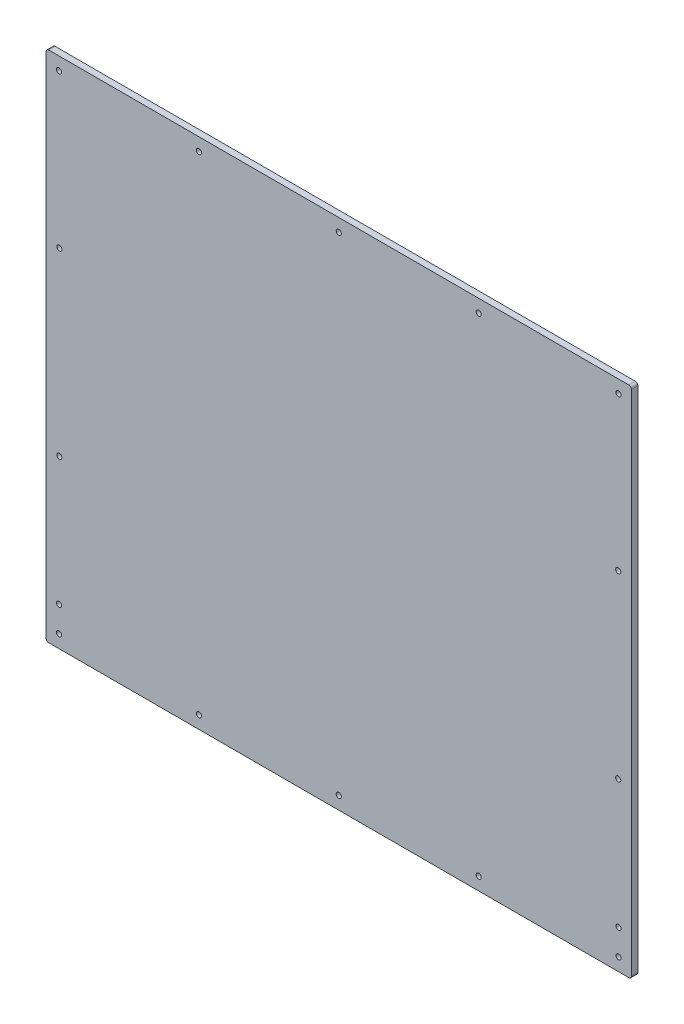
ISO-10303-21;
HEADER;
FILE_DESCRIPTION(('STEP AP214'),'2;1');
FILE_NAME('part.step','',(''),(''),'','','');
FILE_SCHEMA(('AUTOMOTIVE_DESIGN { 1 0 10303 214 1 1 1 1 }'));
ENDSEC;
DATA;
#1=APPLICATION_CONTEXT('core data for automotive mechanical design processes');
#2=APPLICATION_PROTOCOL_DEFINITION('international standard','automotive_design',2000,#1);
#3=PRODUCT_CONTEXT('',#1,'mechanical');
#4=PRODUCT('Part','Part','',(#3));
#5=PRODUCT_RELATED_PRODUCT_CATEGORY('part','',(#4));
#6=PRODUCT_DEFINITION_FORMATION('','',#4);
#7=PRODUCT_DEFINITION_CONTEXT('part definition',#1,'design');
#8=PRODUCT_DEFINITION('design','',#6,#7);
#9=PRODUCT_DEFINITION_SHAPE('','',#8);
#10=(LENGTH_UNIT() NAMED_UNIT(*) SI_UNIT(.MILLI.,.METRE.));
#11=(NAMED_UNIT(*) PLANE_ANGLE_UNIT() SI_UNIT($,.RADIAN.));
#12=(NAMED_UNIT(*) SI_UNIT($,.STERADIAN.) SOLID_ANGLE_UNIT());
#13=UNCERTAINTY_MEASURE_WITH_UNIT(LENGTH_MEASURE(1.E-05),#10,'distance_accuracy_value','');
#14=(GEOMETRIC_REPRESENTATION_CONTEXT(3) GLOBAL_UNCERTAINTY_ASSIGNED_CONTEXT((#13)) GLOBAL_UNIT_ASSIGNED_CONTEXT((#10,
#11,#12)) REPRESENTATION_CONTEXT('',''));
#15=CARTESIAN_POINT('',(0.,0.,0.));
#16=DIRECTION('',(0.,0.,1.));
#17=DIRECTION('',(1.,0.,0.));
#18=AXIS2_PLACEMENT_3D('',#15,#16,#17);
#19=CARTESIAN_POINT('',(-452.,396.,10.));
#20=DIRECTION('',(0.,0.,-1.));
#21=DIRECTION('',(-1.,0.,0.));
#22=AXIS2_PLACEMENT_3D('',#19,#20,#21);
#23=PLANE('',#22);
#24=CARTESIAN_POINT('',(-452.,396.,10.));
#25=DIRECTION('',(0.,0.,1.));
#26=DIRECTION('',(-1.,0.,0.));
#27=AXIS2_PLACEMENT_3D('',#24,#25,#26);
#28=CIRCLE('',#27,4.);
#29=CARTESIAN_POINT('',(-452.,400.,10.));
#30=VERTEX_POINT('',#29);
#31=CARTESIAN_POINT('',(-456.,396.,10.));
#32=VERTEX_POINT('',#31);
#33=EDGE_CURVE('E145',#30,#32,#28,.T.);
#34=ORIENTED_EDGE('',*,*,#33,.T.);
#35=DIRECTION('',(0.,-1.,0.));
#36=VECTOR('',#35,1.);
#37=CARTESIAN_POINT('',(-456.,-396.,10.));
#38=LINE('',#37,#36);
#39=CARTESIAN_POINT('',(-456.,-396.,10.));
#40=VERTEX_POINT('',#39);
#41=EDGE_CURVE('E93',#32,#40,#38,.T.);
#42=ORIENTED_EDGE('',*,*,#41,.T.);
#43=CARTESIAN_POINT('',(-452.,-396.,10.));
#44=DIRECTION('',(0.,0.,1.));
#45=DIRECTION('',(1.,0.,0.));
#46=AXIS2_PLACEMENT_3D('',#43,#44,#45);
#47=CIRCLE('',#46,4.);
#48=CARTESIAN_POINT('',(-452.,-400.,10.));
#49=VERTEX_POINT('',#48);
#50=EDGE_CURVE('E160',#40,#49,#47,.T.);
#51=ORIENTED_EDGE('',*,*,#50,.T.);
#52=DIRECTION('',(1.,0.,0.));
#53=VECTOR('',#52,1.);
#54=CARTESIAN_POINT('',(-452.,-400.,10.));
#55=LINE('',#54,#53);
#56=CARTESIAN_POINT('',(452.,-400.,10.));
#57=VERTEX_POINT('',#56);
#58=EDGE_CURVE('E173',#49,#57,#55,.T.);
#59=ORIENTED_EDGE('',*,*,#58,.T.);
#60=CARTESIAN_POINT('',(452.,-396.,10.));
#61=DIRECTION('',(0.,0.,1.));
#62=DIRECTION('',(1.,0.,0.));
#63=AXIS2_PLACEMENT_3D('',#60,#61,#62);
#64=CIRCLE('',#63,4.);
#65=CARTESIAN_POINT('',(456.,-396.,10.));
#66=VERTEX_POINT('',#65);
#67=EDGE_CURVE('E112',#57,#66,#64,.T.);
#68=ORIENTED_EDGE('',*,*,#67,.T.);
#69=DIRECTION('',(0.,1.,0.));
#70=VECTOR('',#69,1.);
#71=CARTESIAN_POINT('',(456.,-396.,10.));
#72=LINE('',#71,#70);
#73=CARTESIAN_POINT('',(456.,396.,10.));
#74=VERTEX_POINT('',#73);
#75=EDGE_CURVE('E106',#66,#74,#72,.T.);
#76=ORIENTED_EDGE('',*,*,#75,.T.);
#77=CARTESIAN_POINT('',(452.,396.,10.));
#78=DIRECTION('',(0.,0.,1.));
#79=DIRECTION('',(1.,0.,0.));
#80=AXIS2_PLACEMENT_3D('',#77,#78,#79);
#81=CIRCLE('',#80,4.);
#82=CARTESIAN_POINT('',(452.,400.,10.));
#83=VERTEX_POINT('',#82);
#84=EDGE_CURVE('E110',#74,#83,#81,.T.);
#85=ORIENTED_EDGE('',*,*,#84,.T.);
#86=DIRECTION('',(-1.,0.,0.));
#87=VECTOR('',#86,1.);
#88=CARTESIAN_POINT('',(-452.,400.,10.));
#89=LINE('',#88,#87);
#90=EDGE_CURVE('E50',#83,#30,#89,.T.);
#91=ORIENTED_EDGE('',*,*,#90,.T.);
#92=EDGE_LOOP('',(#34,#42,#51,#59,#68,#76,#85,#91));
#93=FACE_BOUND('',#92,.T.);
#94=CARTESIAN_POINT('',(436.,380.,10.));
#95=DIRECTION('',(0.,0.,1.));
#96=DIRECTION('',(1.,0.,0.));
#97=AXIS2_PLACEMENT_3D('',#94,#95,#96);
#98=CIRCLE('',#97,3.99999999999999);
#99=CARTESIAN_POINT('',(440.,380.,10.));
#100=VERTEX_POINT('',#99);
#101=EDGE_CURVE('E134',#100,#100,#98,.T.);
#102=ORIENTED_EDGE('',*,*,#101,.F.);
#103=EDGE_LOOP('',(#102));
#104=FACE_BOUND('',#103,.T.);
#105=CARTESIAN_POINT('',(435.5,141.,10.));
#106=DIRECTION('',(0.,0.,1.));
#107=DIRECTION('',(1.,0.,0.));
#108=AXIS2_PLACEMENT_3D('',#105,#106,#107);
#109=CIRCLE('',#108,3.99999999999999);
#110=CARTESIAN_POINT('',(439.5,141.,10.));
#111=VERTEX_POINT('',#110);
#112=EDGE_CURVE('E182',#111,#111,#109,.T.);
#113=ORIENTED_EDGE('',*,*,#112,.F.);
#114=EDGE_LOOP('',(#113));
#115=FACE_BOUND('',#114,.T.);
#116=CARTESIAN_POINT('',(435.500000000003,-140.,10.));
#117=DIRECTION('',(0.,0.,1.));
#118=DIRECTION('',(1.,0.,0.));
#119=AXIS2_PLACEMENT_3D('',#116,#117,#118);
#120=CIRCLE('',#119,3.99999999999999);
#121=CARTESIAN_POINT('',(439.500000000003,-140.,10.));
#122=VERTEX_POINT('',#121);
#123=EDGE_CURVE('E188',#122,#122,#120,.T.);
#124=ORIENTED_EDGE('',*,*,#123,.F.);
#125=EDGE_LOOP('',(#124));
#126=FACE_BOUND('',#125,.T.);
#127=CARTESIAN_POINT('',(-435.500000000003,-140.,10.));
#128=DIRECTION('',(0.,0.,1.));
#129=DIRECTION('',(-1.,0.,0.));
#130=AXIS2_PLACEMENT_3D('',#127,#128,#129);
#131=CIRCLE('',#130,3.99999999999999);
#132=CARTESIAN_POINT('',(-439.500000000003,-140.,10.));
#133=VERTEX_POINT('',#132);
#134=EDGE_CURVE('E194',#133,#133,#131,.T.);
#135=ORIENTED_EDGE('',*,*,#134,.F.);
#136=EDGE_LOOP('',(#135));
#137=FACE_BOUND('',#136,.T.);
#138=CARTESIAN_POINT('',(-436.,380.,10.));
#139=DIRECTION('',(0.,0.,1.));
#140=DIRECTION('',(-1.,0.,0.));
#141=AXIS2_PLACEMENT_3D('',#138,#139,#140);
#142=CIRCLE('',#141,3.99999999999999);
#143=CARTESIAN_POINT('',(-440.,380.,10.));
#144=VERTEX_POINT('',#143);
#145=EDGE_CURVE('E200',#144,#144,#142,.T.);
#146=ORIENTED_EDGE('',*,*,#145,.F.);
#147=EDGE_LOOP('',(#146));
#148=FACE_BOUND('',#147,.T.);
#149=CARTESIAN_POINT('',(-435.5,141.,10.));
#150=DIRECTION('',(0.,0.,1.));
#151=DIRECTION('',(-1.,0.,0.));
#152=AXIS2_PLACEMENT_3D('',#149,#150,#151);
#153=CIRCLE('',#152,3.99999999999999);
#154=CARTESIAN_POINT('',(-439.5,141.,10.));
#155=VERTEX_POINT('',#154);
#156=EDGE_CURVE('E206',#155,#155,#153,.T.);
#157=ORIENTED_EDGE('',*,*,#156,.F.);
#158=EDGE_LOOP('',(#157));
#159=FACE_BOUND('',#158,.T.);
#160=CARTESIAN_POINT('',(436.,-380.,10.));
#161=DIRECTION('',(0.,0.,1.));
#162=DIRECTION('',(-1.,0.,0.));
#163=AXIS2_PLACEMENT_3D('',#160,#161,#162);
#164=CIRCLE('',#163,3.99999999999999);
#165=CARTESIAN_POINT('',(432.,-380.,10.));
#166=VERTEX_POINT('',#165);
#167=EDGE_CURVE('E212',#166,#166,#164,.T.);
#168=ORIENTED_EDGE('',*,*,#167,.F.);
#169=EDGE_LOOP('',(#168));
#170=FACE_BOUND('',#169,.T.);
#171=CARTESIAN_POINT('',(436.,-340.,10.));
#172=DIRECTION('',(0.,0.,1.));
#173=DIRECTION('',(-1.,0.,0.));
#174=AXIS2_PLACEMENT_3D('',#171,#172,#173);
#175=CIRCLE('',#174,3.99999999999999);
#176=CARTESIAN_POINT('',(432.,-340.,10.));
#177=VERTEX_POINT('',#176);
#178=EDGE_CURVE('E218',#177,#177,#175,.T.);
#179=ORIENTED_EDGE('',*,*,#178,.F.);
#180=EDGE_LOOP('',(#179));
#181=FACE_BOUND('',#180,.T.);
#182=CARTESIAN_POINT('',(-435.999999999999,-340.,10.));
#183=DIRECTION('',(0.,0.,1.));
#184=DIRECTION('',(1.,0.,0.));
#185=AXIS2_PLACEMENT_3D('',#182,#183,#184);
#186=CIRCLE('',#185,3.99999999999999);
#187=CARTESIAN_POINT('',(-431.999999999999,-340.,10.));
#188=VERTEX_POINT('',#187);
#189=EDGE_CURVE('E224',#188,#188,#186,.T.);
#190=ORIENTED_EDGE('',*,*,#189,.F.);
#191=EDGE_LOOP('',(#190));
#192=FACE_BOUND('',#191,.T.);
#193=CARTESIAN_POINT('',(-435.999999999999,-380.,10.));
#194=DIRECTION('',(0.,0.,1.));
#195=DIRECTION('',(1.,0.,0.));
#196=AXIS2_PLACEMENT_3D('',#193,#194,#195);
#197=CIRCLE('',#196,3.99999999999999);
#198=CARTESIAN_POINT('',(-431.999999999999,-380.,10.));
#199=VERTEX_POINT('',#198);
#200=EDGE_CURVE('E230',#199,#199,#197,.T.);
#201=ORIENTED_EDGE('',*,*,#200,.F.);
#202=EDGE_LOOP('',(#201));
#203=FACE_BOUND('',#202,.T.);
#204=CARTESIAN_POINT('',(-218.,380.000000000005,10.));
#205=DIRECTION('',(0.,0.,1.));
#206=DIRECTION('',(1.,0.,0.));
#207=AXIS2_PLACEMENT_3D('',#204,#205,#206);
#208=CIRCLE('',#207,3.99999999999999);
#209=CARTESIAN_POINT('',(-214.,380.000000000005,10.));
#210=VERTEX_POINT('',#209);
#211=EDGE_CURVE('E236',#210,#210,#208,.T.);
#212=ORIENTED_EDGE('',*,*,#211,.F.);
#213=EDGE_LOOP('',(#212));
#214=FACE_BOUND('',#213,.T.);
#215=CARTESIAN_POINT('',(218.,-380.000000000002,10.));
#216=DIRECTION('',(0.,0.,1.));
#217=DIRECTION('',(-1.,0.,0.));
#218=AXIS2_PLACEMENT_3D('',#215,#216,#217);
#219=CIRCLE('',#218,3.99999999999999);
#220=CARTESIAN_POINT('',(214.,-380.000000000002,10.));
#221=VERTEX_POINT('',#220);
#222=EDGE_CURVE('E242',#221,#221,#219,.T.);
#223=ORIENTED_EDGE('',*,*,#222,.F.);
#224=EDGE_LOOP('',(#223));
#225=FACE_BOUND('',#224,.T.);
#226=CARTESIAN_POINT('',(-2.22044604925031E-13,-380.000000000003,10.));
#227=DIRECTION('',(0.,0.,1.));
#228=DIRECTION('',(-1.,0.,0.));
#229=AXIS2_PLACEMENT_3D('',#226,#227,#228);
#230=CIRCLE('',#229,3.99999999999999);
#231=CARTESIAN_POINT('',(-4.00000000000021,-380.000000000003,10.));
#232=VERTEX_POINT('',#231);
#233=EDGE_CURVE('E248',#232,#232,#230,.T.);
#234=ORIENTED_EDGE('',*,*,#233,.F.);
#235=EDGE_LOOP('',(#234));
#236=FACE_BOUND('',#235,.T.);
#237=CARTESIAN_POINT('',(-218.,-380.000000000005,10.));
#238=DIRECTION('',(0.,0.,1.));
#239=DIRECTION('',(-1.,0.,0.));
#240=AXIS2_PLACEMENT_3D('',#237,#238,#239);
#241=CIRCLE('',#240,3.99999999999999);
#242=CARTESIAN_POINT('',(-222.,-380.000000000005,10.));
#243=VERTEX_POINT('',#242);
#244=EDGE_CURVE('E254',#243,#243,#241,.T.);
#245=ORIENTED_EDGE('',*,*,#244,.F.);
#246=EDGE_LOOP('',(#245));
#247=FACE_BOUND('',#246,.T.);
#248=CARTESIAN_POINT('',(-4.44089209850063E-13,380.000000000003,10.));
#249=DIRECTION('',(0.,0.,1.));
#250=DIRECTION('',(1.,0.,0.));
#251=AXIS2_PLACEMENT_3D('',#248,#249,#250);
#252=CIRCLE('',#251,3.99999999999999);
#253=CARTESIAN_POINT('',(3.99999999999955,380.000000000003,10.));
#254=VERTEX_POINT('',#253);
#255=EDGE_CURVE('E260',#254,#254,#252,.T.);
#256=ORIENTED_EDGE('',*,*,#255,.F.);
#257=EDGE_LOOP('',(#256));
#258=FACE_BOUND('',#257,.T.);
#259=CARTESIAN_POINT('',(217.999999999999,380.000000000002,10.));
#260=DIRECTION('',(0.,0.,1.));
#261=DIRECTION('',(1.,0.,0.));
#262=AXIS2_PLACEMENT_3D('',#259,#260,#261);
#263=CIRCLE('',#262,3.99999999999999);
#264=CARTESIAN_POINT('',(221.999999999999,380.000000000002,10.));
#265=VERTEX_POINT('',#264);
#266=EDGE_CURVE('E266',#265,#265,#263,.T.);
#267=ORIENTED_EDGE('',*,*,#266,.F.);
#268=EDGE_LOOP('',(#267));
#269=FACE_BOUND('',#268,.T.);
#270=ADVANCED_FACE('F33',(#93,#104,#115,#126,#137,#148,#159,#170,#181,#192,#203,#214,#225,#236,
#247,#258,#269),#23,.F.);
#271=CARTESIAN_POINT('',(-452.,396.,0.));
#272=DIRECTION('',(0.,0.,-1.));
#273=DIRECTION('',(-1.,0.,0.));
#274=AXIS2_PLACEMENT_3D('',#271,#272,#273);
#275=PLANE('',#274);
#276=CARTESIAN_POINT('',(-4.44089209850063E-13,380.000000000003,0.));
#277=DIRECTION('',(0.,0.,1.));
#278=DIRECTION('',(1.,0.,0.));
#279=AXIS2_PLACEMENT_3D('',#276,#277,#278);
#280=CIRCLE('',#279,3.99999999999999);
#281=CARTESIAN_POINT('',(3.99999999999955,380.000000000003,0.));
#282=VERTEX_POINT('',#281);
#283=EDGE_CURVE('E263',#282,#282,#280,.T.);
#284=ORIENTED_EDGE('',*,*,#283,.T.);
#285=EDGE_LOOP('',(#284));
#286=FACE_BOUND('',#285,.T.);
#287=CARTESIAN_POINT('',(-2.22044604925031E-13,-380.000000000003,0.));
#288=DIRECTION('',(0.,0.,1.));
#289=DIRECTION('',(-1.,0.,0.));
#290=AXIS2_PLACEMENT_3D('',#287,#288,#289);
#291=CIRCLE('',#290,3.99999999999999);
#292=CARTESIAN_POINT('',(-4.00000000000021,-380.000000000003,0.));
#293=VERTEX_POINT('',#292);
#294=EDGE_CURVE('E251',#293,#293,#291,.T.);
#295=ORIENTED_EDGE('',*,*,#294,.T.);
#296=EDGE_LOOP('',(#295));
#297=FACE_BOUND('',#296,.T.);
#298=CARTESIAN_POINT('',(-218.,380.000000000005,0.));
#299=DIRECTION('',(0.,0.,1.));
#300=DIRECTION('',(1.,0.,0.));
#301=AXIS2_PLACEMENT_3D('',#298,#299,#300);
#302=CIRCLE('',#301,3.99999999999999);
#303=CARTESIAN_POINT('',(-214.,380.000000000005,0.));
#304=VERTEX_POINT('',#303);
#305=EDGE_CURVE('E239',#304,#304,#302,.T.);
#306=ORIENTED_EDGE('',*,*,#305,.T.);
#307=EDGE_LOOP('',(#306));
#308=FACE_BOUND('',#307,.T.);
#309=CARTESIAN_POINT('',(-435.999999999999,-340.,0.));
#310=DIRECTION('',(0.,0.,1.));
#311=DIRECTION('',(1.,0.,0.));
#312=AXIS2_PLACEMENT_3D('',#309,#310,#311);
#313=CIRCLE('',#312,3.99999999999999);
#314=CARTESIAN_POINT('',(-431.999999999999,-340.,0.));
#315=VERTEX_POINT('',#314);
#316=EDGE_CURVE('E227',#315,#315,#313,.T.);
#317=ORIENTED_EDGE('',*,*,#316,.T.);
#318=EDGE_LOOP('',(#317));
#319=FACE_BOUND('',#318,.T.);
#320=CARTESIAN_POINT('',(436.,-380.,0.));
#321=DIRECTION('',(0.,0.,1.));
#322=DIRECTION('',(-1.,0.,0.));
#323=AXIS2_PLACEMENT_3D('',#320,#321,#322);
#324=CIRCLE('',#323,3.99999999999999);
#325=CARTESIAN_POINT('',(432.,-380.,0.));
#326=VERTEX_POINT('',#325);
#327=EDGE_CURVE('E215',#326,#326,#324,.T.);
#328=ORIENTED_EDGE('',*,*,#327,.T.);
#329=EDGE_LOOP('',(#328));
#330=FACE_BOUND('',#329,.T.);
#331=CARTESIAN_POINT('',(-436.,380.,0.));
#332=DIRECTION('',(0.,0.,1.));
#333=DIRECTION('',(-1.,0.,0.));
#334=AXIS2_PLACEMENT_3D('',#331,#332,#333);
#335=CIRCLE('',#334,3.99999999999999);
#336=CARTESIAN_POINT('',(-440.,380.,0.));
#337=VERTEX_POINT('',#336);
#338=EDGE_CURVE('E203',#337,#337,#335,.T.);
#339=ORIENTED_EDGE('',*,*,#338,.T.);
#340=EDGE_LOOP('',(#339));
#341=FACE_BOUND('',#340,.T.);
#342=CARTESIAN_POINT('',(435.500000000003,-140.,0.));
#343=DIRECTION('',(0.,0.,1.));
#344=DIRECTION('',(1.,0.,0.));
#345=AXIS2_PLACEMENT_3D('',#342,#343,#344);
#346=CIRCLE('',#345,3.99999999999999);
#347=CARTESIAN_POINT('',(439.500000000003,-140.,0.));
#348=VERTEX_POINT('',#347);
#349=EDGE_CURVE('E191',#348,#348,#346,.T.);
#350=ORIENTED_EDGE('',*,*,#349,.T.);
#351=EDGE_LOOP('',(#350));
#352=FACE_BOUND('',#351,.T.);
#353=CARTESIAN_POINT('',(436.,380.,0.));
#354=DIRECTION('',(0.,0.,1.));
#355=DIRECTION('',(1.,0.,0.));
#356=AXIS2_PLACEMENT_3D('',#353,#354,#355);
#357=CIRCLE('',#356,3.99999999999999);
#358=CARTESIAN_POINT('',(440.,380.,0.));
#359=VERTEX_POINT('',#358);
#360=EDGE_CURVE('E179',#359,#359,#357,.T.);
#361=ORIENTED_EDGE('',*,*,#360,.T.);
#362=EDGE_LOOP('',(#361));
#363=FACE_BOUND('',#362,.T.);
#364=CARTESIAN_POINT('',(-452.,396.,0.));
#365=DIRECTION('',(0.,0.,1.));
#366=DIRECTION('',(-1.,0.,0.));
#367=AXIS2_PLACEMENT_3D('',#364,#365,#366);
#368=CIRCLE('',#367,4.);
#369=CARTESIAN_POINT('',(-452.,400.,0.));
#370=VERTEX_POINT('',#369);
#371=CARTESIAN_POINT('',(-456.,396.,0.));
#372=VERTEX_POINT('',#371);
#373=EDGE_CURVE('E130',#370,#372,#368,.T.);
#374=ORIENTED_EDGE('',*,*,#373,.F.);
#375=DIRECTION('',(-1.,0.,0.));
#376=VECTOR('',#375,1.);
#377=CARTESIAN_POINT('',(-452.,400.,0.));
#378=LINE('',#377,#376);
#379=CARTESIAN_POINT('',(452.,400.,0.));
#380=VERTEX_POINT('',#379);
#381=EDGE_CURVE('E85',#380,#370,#378,.T.);
#382=ORIENTED_EDGE('',*,*,#381,.F.);
#383=CARTESIAN_POINT('',(452.,396.,0.));
#384=DIRECTION('',(0.,0.,1.));
#385=DIRECTION('',(1.,0.,0.));
#386=AXIS2_PLACEMENT_3D('',#383,#384,#385);
#387=CIRCLE('',#386,4.);
#388=CARTESIAN_POINT('',(456.,396.,0.));
#389=VERTEX_POINT('',#388);
#390=EDGE_CURVE('E79',#389,#380,#387,.T.);
#391=ORIENTED_EDGE('',*,*,#390,.F.);
#392=DIRECTION('',(0.,1.,0.));
#393=VECTOR('',#392,1.);
#394=CARTESIAN_POINT('',(456.,-396.,0.));
#395=LINE('',#394,#393);
#396=CARTESIAN_POINT('',(456.,-396.,0.));
#397=VERTEX_POINT('',#396);
#398=EDGE_CURVE('E120',#397,#389,#395,.T.);
#399=ORIENTED_EDGE('',*,*,#398,.F.);
#400=CARTESIAN_POINT('',(452.,-396.,0.));
#401=DIRECTION('',(0.,0.,1.));
#402=DIRECTION('',(1.,0.,0.));
#403=AXIS2_PLACEMENT_3D('',#400,#401,#402);
#404=CIRCLE('',#403,4.);
#405=CARTESIAN_POINT('',(452.,-400.,0.));
#406=VERTEX_POINT('',#405);
#407=EDGE_CURVE('E140',#406,#397,#404,.T.);
#408=ORIENTED_EDGE('',*,*,#407,.F.);
#409=DIRECTION('',(1.,0.,0.));
#410=VECTOR('',#409,1.);
#411=CARTESIAN_POINT('',(-452.,-400.,0.));
#412=LINE('',#411,#410);
#413=CARTESIAN_POINT('',(-452.,-400.,0.));
#414=VERTEX_POINT('',#413);
#415=EDGE_CURVE('E138',#414,#406,#412,.T.);
#416=ORIENTED_EDGE('',*,*,#415,.F.);
#417=CARTESIAN_POINT('',(-452.,-396.,0.));
#418=DIRECTION('',(0.,0.,1.));
#419=DIRECTION('',(1.,0.,0.));
#420=AXIS2_PLACEMENT_3D('',#417,#418,#419);
#421=CIRCLE('',#420,4.);
#422=CARTESIAN_POINT('',(-456.,-396.,0.));
#423=VERTEX_POINT('',#422);
#424=EDGE_CURVE('E136',#423,#414,#421,.T.);
#425=ORIENTED_EDGE('',*,*,#424,.F.);
#426=DIRECTION('',(0.,-1.,0.));
#427=VECTOR('',#426,1.);
#428=CARTESIAN_POINT('',(-456.,-396.,0.));
#429=LINE('',#428,#427);
#430=EDGE_CURVE('E133',#372,#423,#429,.T.);
#431=ORIENTED_EDGE('',*,*,#430,.F.);
#432=EDGE_LOOP('',(#374,#382,#391,#399,#408,#416,#425,#431));
#433=FACE_BOUND('',#432,.T.);
#434=CARTESIAN_POINT('',(435.5,141.,0.));
#435=DIRECTION('',(0.,0.,1.));
#436=DIRECTION('',(1.,0.,0.));
#437=AXIS2_PLACEMENT_3D('',#434,#435,#436);
#438=CIRCLE('',#437,3.99999999999999);
#439=CARTESIAN_POINT('',(439.5,141.,0.));
#440=VERTEX_POINT('',#439);
#441=EDGE_CURVE('E185',#440,#440,#438,.T.);
#442=ORIENTED_EDGE('',*,*,#441,.T.);
#443=EDGE_LOOP('',(#442));
#444=FACE_BOUND('',#443,.T.);
#445=CARTESIAN_POINT('',(-435.500000000003,-140.,0.));
#446=DIRECTION('',(0.,0.,1.));
#447=DIRECTION('',(-1.,0.,0.));
#448=AXIS2_PLACEMENT_3D('',#445,#446,#447);
#449=CIRCLE('',#448,3.99999999999999);
#450=CARTESIAN_POINT('',(-439.500000000003,-140.,0.));
#451=VERTEX_POINT('',#450);
#452=EDGE_CURVE('E197',#451,#451,#449,.T.);
#453=ORIENTED_EDGE('',*,*,#452,.T.);
#454=EDGE_LOOP('',(#453));
#455=FACE_BOUND('',#454,.T.);
#456=CARTESIAN_POINT('',(-435.5,141.,0.));
#457=DIRECTION('',(0.,0.,1.));
#458=DIRECTION('',(-1.,0.,0.));
#459=AXIS2_PLACEMENT_3D('',#456,#457,#458);
#460=CIRCLE('',#459,3.99999999999999);
#461=CARTESIAN_POINT('',(-439.5,141.,0.));
#462=VERTEX_POINT('',#461);
#463=EDGE_CURVE('E209',#462,#462,#460,.T.);
#464=ORIENTED_EDGE('',*,*,#463,.T.);
#465=EDGE_LOOP('',(#464));
#466=FACE_BOUND('',#465,.T.);
#467=CARTESIAN_POINT('',(436.,-340.,0.));
#468=DIRECTION('',(0.,0.,1.));
#469=DIRECTION('',(-1.,0.,0.));
#470=AXIS2_PLACEMENT_3D('',#467,#468,#469);
#471=CIRCLE('',#470,3.99999999999999);
#472=CARTESIAN_POINT('',(432.,-340.,0.));
#473=VERTEX_POINT('',#472);
#474=EDGE_CURVE('E221',#473,#473,#471,.T.);
#475=ORIENTED_EDGE('',*,*,#474,.T.);
#476=EDGE_LOOP('',(#475));
#477=FACE_BOUND('',#476,.T.);
#478=CARTESIAN_POINT('',(-435.999999999999,-380.,0.));
#479=DIRECTION('',(0.,0.,1.));
#480=DIRECTION('',(1.,0.,0.));
#481=AXIS2_PLACEMENT_3D('',#478,#479,#480);
#482=CIRCLE('',#481,3.99999999999999);
#483=CARTESIAN_POINT('',(-431.999999999999,-380.,0.));
#484=VERTEX_POINT('',#483);
#485=EDGE_CURVE('E233',#484,#484,#482,.T.);
#486=ORIENTED_EDGE('',*,*,#485,.T.);
#487=EDGE_LOOP('',(#486));
#488=FACE_BOUND('',#487,.T.);
#489=CARTESIAN_POINT('',(218.,-380.000000000002,0.));
#490=DIRECTION('',(0.,0.,1.));
#491=DIRECTION('',(-1.,0.,0.));
#492=AXIS2_PLACEMENT_3D('',#489,#490,#491);
#493=CIRCLE('',#492,3.99999999999999);
#494=CARTESIAN_POINT('',(214.,-380.000000000002,0.));
#495=VERTEX_POINT('',#494);
#496=EDGE_CURVE('E245',#495,#495,#493,.T.);
#497=ORIENTED_EDGE('',*,*,#496,.T.);
#498=EDGE_LOOP('',(#497));
#499=FACE_BOUND('',#498,.T.);
#500=CARTESIAN_POINT('',(-218.,-380.000000000005,0.));
#501=DIRECTION('',(0.,0.,1.));
#502=DIRECTION('',(-1.,0.,0.));
#503=AXIS2_PLACEMENT_3D('',#500,#501,#502);
#504=CIRCLE('',#503,3.99999999999999);
#505=CARTESIAN_POINT('',(-222.,-380.000000000005,0.));
#506=VERTEX_POINT('',#505);
#507=EDGE_CURVE('E257',#506,#506,#504,.T.);
#508=ORIENTED_EDGE('',*,*,#507,.T.);
#509=EDGE_LOOP('',(#508));
#510=FACE_BOUND('',#509,.T.);
#511=CARTESIAN_POINT('',(217.999999999999,380.000000000002,0.));
#512=DIRECTION('',(0.,0.,1.));
#513=DIRECTION('',(1.,0.,0.));
#514=AXIS2_PLACEMENT_3D('',#511,#512,#513);
#515=CIRCLE('',#514,3.99999999999999);
#516=CARTESIAN_POINT('',(221.999999999999,380.000000000002,0.));
#517=VERTEX_POINT('',#516);
#518=EDGE_CURVE('E269',#517,#517,#515,.T.);
#519=ORIENTED_EDGE('',*,*,#518,.T.);
#520=EDGE_LOOP('',(#519));
#521=FACE_BOUND('',#520,.T.);
#522=ADVANCED_FACE('F164',(#286,#297,#308,#319,#330,#341,#352,#363,#433,#444,#455,#466,#477,
#488,#499,#510,#521),#275,.T.);
#523=CARTESIAN_POINT('',(-452.,396.,10.));
#524=DIRECTION('',(0.,0.,-1.));
#525=DIRECTION('',(-1.,0.,0.));
#526=AXIS2_PLACEMENT_3D('',#523,#524,#525);
#527=CYLINDRICAL_SURFACE('',#526,4.);
#528=ORIENTED_EDGE('',*,*,#373,.T.);
#529=DIRECTION('',(0.,0.,-1.));
#530=VECTOR('',#529,1.);
#531=CARTESIAN_POINT('',(-456.,396.,10.));
#532=LINE('',#531,#530);
#533=EDGE_CURVE('E11',#32,#372,#532,.T.);
#534=ORIENTED_EDGE('',*,*,#533,.F.);
#535=ORIENTED_EDGE('',*,*,#33,.F.);
#536=DIRECTION('',(0.,0.,-1.));
#537=VECTOR('',#536,1.);
#538=CARTESIAN_POINT('',(-452.,400.,10.));
#539=LINE('',#538,#537);
#540=EDGE_CURVE('E126',#30,#370,#539,.T.);
#541=ORIENTED_EDGE('',*,*,#540,.T.);
#542=EDGE_LOOP('',(#528,#534,#535,#541));
#543=FACE_BOUND('',#542,.T.);
#544=ADVANCED_FACE('F35',(#543),#527,.T.);
#545=CARTESIAN_POINT('',(-456.,-396.,10.));
#546=DIRECTION('',(1.,0.,0.));
#547=DIRECTION('',(0.,0.,-1.));
#548=AXIS2_PLACEMENT_3D('',#545,#546,#547);
#549=PLANE('',#548);
#550=ORIENTED_EDGE('',*,*,#430,.T.);
#551=DIRECTION('',(0.,0.,-1.));
#552=VECTOR('',#551,1.);
#553=CARTESIAN_POINT('',(-456.,-396.,10.));
#554=LINE('',#553,#552);
#555=EDGE_CURVE('E42',#40,#423,#554,.T.);
#556=ORIENTED_EDGE('',*,*,#555,.F.);
#557=ORIENTED_EDGE('',*,*,#41,.F.);
#558=ORIENTED_EDGE('',*,*,#533,.T.);
#559=EDGE_LOOP('',(#550,#556,#557,#558));
#560=FACE_BOUND('',#559,.T.);
#561=ADVANCED_FACE('F301',(#560),#549,.F.);
#562=CARTESIAN_POINT('',(-452.,-396.,10.));
#563=DIRECTION('',(0.,0.,-1.));
#564=DIRECTION('',(-1.,0.,0.));
#565=AXIS2_PLACEMENT_3D('',#562,#563,#564);
#566=CYLINDRICAL_SURFACE('',#565,4.);
#567=ORIENTED_EDGE('',*,*,#424,.T.);
#568=DIRECTION('',(0.,0.,-1.));
#569=VECTOR('',#568,1.);
#570=CARTESIAN_POINT('',(-452.,-400.,10.));
#571=LINE('',#570,#569);
#572=EDGE_CURVE('E152',#49,#414,#571,.T.);
#573=ORIENTED_EDGE('',*,*,#572,.F.);
#574=ORIENTED_EDGE('',*,*,#50,.F.);
#575=ORIENTED_EDGE('',*,*,#555,.T.);
#576=EDGE_LOOP('',(#567,#573,#574,#575));
#577=FACE_BOUND('',#576,.T.);
#578=ADVANCED_FACE('F158',(#577),#566,.T.);
#579=CARTESIAN_POINT('',(-452.,-400.,10.));
#580=DIRECTION('',(0.,1.,0.));
#581=DIRECTION('',(0.,0.,1.));
#582=AXIS2_PLACEMENT_3D('',#579,#580,#581);
#583=PLANE('',#582);
#584=ORIENTED_EDGE('',*,*,#415,.T.);
#585=DIRECTION('',(0.,0.,-1.));
#586=VECTOR('',#585,1.);
#587=CARTESIAN_POINT('',(452.,-400.,10.));
#588=LINE('',#587,#586);
#589=EDGE_CURVE('E149',#57,#406,#588,.T.);
#590=ORIENTED_EDGE('',*,*,#589,.F.);
#591=ORIENTED_EDGE('',*,*,#58,.F.);
#592=ORIENTED_EDGE('',*,*,#572,.T.);
#593=EDGE_LOOP('',(#584,#590,#591,#592));
#594=FACE_BOUND('',#593,.T.);
#595=ADVANCED_FACE('F169',(#594),#583,.F.);
#596=CARTESIAN_POINT('',(452.,-396.,10.));
#597=DIRECTION('',(0.,0.,-1.));
#598=DIRECTION('',(-1.,0.,0.));
#599=AXIS2_PLACEMENT_3D('',#596,#597,#598);
#600=CYLINDRICAL_SURFACE('',#599,4.);
#601=ORIENTED_EDGE('',*,*,#407,.T.);
#602=DIRECTION('',(0.,0.,-1.));
#603=VECTOR('',#602,1.);
#604=CARTESIAN_POINT('',(456.,-396.,10.));
#605=LINE('',#604,#603);
#606=EDGE_CURVE('E121',#66,#397,#605,.T.);
#607=ORIENTED_EDGE('',*,*,#606,.F.);
#608=ORIENTED_EDGE('',*,*,#67,.F.);
#609=ORIENTED_EDGE('',*,*,#589,.T.);
#610=EDGE_LOOP('',(#601,#607,#608,#609));
#611=FACE_BOUND('',#610,.T.);
#612=ADVANCED_FACE('F172',(#611),#600,.T.);
#613=CARTESIAN_POINT('',(456.,-396.,10.));
#614=DIRECTION('',(-1.,0.,0.));
#615=DIRECTION('',(0.,0.,1.));
#616=AXIS2_PLACEMENT_3D('',#613,#614,#615);
#617=PLANE('',#616);
#618=ORIENTED_EDGE('',*,*,#398,.T.);
#619=DIRECTION('',(0.,0.,-1.));
#620=VECTOR('',#619,1.);
#621=CARTESIAN_POINT('',(456.,396.,10.));
#622=LINE('',#621,#620);
#623=EDGE_CURVE('E117',#74,#389,#622,.T.);
#624=ORIENTED_EDGE('',*,*,#623,.F.);
#625=ORIENTED_EDGE('',*,*,#75,.F.);
#626=ORIENTED_EDGE('',*,*,#606,.T.);
#627=EDGE_LOOP('',(#618,#624,#625,#626));
#628=FACE_BOUND('',#627,.T.);
#629=ADVANCED_FACE('F118',(#628),#617,.F.);
#630=CARTESIAN_POINT('',(452.,396.,10.));
#631=DIRECTION('',(0.,0.,-1.));
#632=DIRECTION('',(-1.,0.,0.));
#633=AXIS2_PLACEMENT_3D('',#630,#631,#632);
#634=CYLINDRICAL_SURFACE('',#633,4.);
#635=ORIENTED_EDGE('',*,*,#390,.T.);
#636=DIRECTION('',(0.,0.,-1.));
#637=VECTOR('',#636,1.);
#638=CARTESIAN_POINT('',(452.,400.,10.));
#639=LINE('',#638,#637);
#640=EDGE_CURVE('E122',#83,#380,#639,.T.);
#641=ORIENTED_EDGE('',*,*,#640,.F.);
#642=ORIENTED_EDGE('',*,*,#84,.F.);
#643=ORIENTED_EDGE('',*,*,#623,.T.);
#644=EDGE_LOOP('',(#635,#641,#642,#643));
#645=FACE_BOUND('',#644,.T.);
#646=ADVANCED_FACE('F124',(#645),#634,.T.);
#647=CARTESIAN_POINT('',(-452.,400.,10.));
#648=DIRECTION('',(0.,-1.,0.));
#649=DIRECTION('',(0.,0.,-1.));
#650=AXIS2_PLACEMENT_3D('',#647,#648,#649);
#651=PLANE('',#650);
#652=ORIENTED_EDGE('',*,*,#381,.T.);
#653=ORIENTED_EDGE('',*,*,#540,.F.);
#654=ORIENTED_EDGE('',*,*,#90,.F.);
#655=ORIENTED_EDGE('',*,*,#640,.T.);
#656=EDGE_LOOP('',(#652,#653,#654,#655));
#657=FACE_BOUND('',#656,.T.);
#658=ADVANCED_FACE('F289',(#657),#651,.F.);
#659=CARTESIAN_POINT('',(436.,380.,10.));
#660=DIRECTION('',(0.,0.,-1.));
#661=DIRECTION('',(-1.,0.,0.));
#662=AXIS2_PLACEMENT_3D('',#659,#660,#661);
#663=CYLINDRICAL_SURFACE('',#662,3.99999999999999);
#664=ORIENTED_EDGE('',*,*,#101,.T.);
#665=EDGE_LOOP('',(#664));
#666=FACE_BOUND('',#665,.T.);
#667=ORIENTED_EDGE('',*,*,#360,.F.);
#668=EDGE_LOOP('',(#667));
#669=FACE_BOUND('',#668,.T.);
#670=ADVANCED_FACE('F286',(#666,#669),#663,.F.);
#671=CARTESIAN_POINT('',(435.5,141.,10.));
#672=DIRECTION('',(0.,0.,-1.));
#673=DIRECTION('',(-1.,0.,0.));
#674=AXIS2_PLACEMENT_3D('',#671,#672,#673);
#675=CYLINDRICAL_SURFACE('',#674,3.99999999999999);
#676=ORIENTED_EDGE('',*,*,#112,.T.);
#677=EDGE_LOOP('',(#676));
#678=FACE_BOUND('',#677,.T.);
#679=ORIENTED_EDGE('',*,*,#441,.F.);
#680=EDGE_LOOP('',(#679));
#681=FACE_BOUND('',#680,.T.);
#682=ADVANCED_FACE('F365',(#678,#681),#675,.F.);
#683=CARTESIAN_POINT('',(435.500000000003,-140.,10.));
#684=DIRECTION('',(0.,0.,-1.));
#685=DIRECTION('',(-1.,0.,0.));
#686=AXIS2_PLACEMENT_3D('',#683,#684,#685);
#687=CYLINDRICAL_SURFACE('',#686,3.99999999999999);
#688=ORIENTED_EDGE('',*,*,#123,.T.);
#689=EDGE_LOOP('',(#688));
#690=FACE_BOUND('',#689,.T.);
#691=ORIENTED_EDGE('',*,*,#349,.F.);
#692=EDGE_LOOP('',(#691));
#693=FACE_BOUND('',#692,.T.);
#694=ADVANCED_FACE('F373',(#690,#693),#687,.F.);
#695=CARTESIAN_POINT('',(-435.500000000003,-140.,10.));
#696=DIRECTION('',(0.,0.,-1.));
#697=DIRECTION('',(-1.,0.,0.));
#698=AXIS2_PLACEMENT_3D('',#695,#696,#697);
#699=CYLINDRICAL_SURFACE('',#698,3.99999999999999);
#700=ORIENTED_EDGE('',*,*,#134,.T.);
#701=EDGE_LOOP('',(#700));
#702=FACE_BOUND('',#701,.T.);
#703=ORIENTED_EDGE('',*,*,#452,.F.);
#704=EDGE_LOOP('',(#703));
#705=FACE_BOUND('',#704,.T.);
#706=ADVANCED_FACE('F381',(#702,#705),#699,.F.);
#707=CARTESIAN_POINT('',(-436.,380.,10.));
#708=DIRECTION('',(0.,0.,-1.));
#709=DIRECTION('',(-1.,0.,0.));
#710=AXIS2_PLACEMENT_3D('',#707,#708,#709);
#711=CYLINDRICAL_SURFACE('',#710,3.99999999999999);
#712=ORIENTED_EDGE('',*,*,#145,.T.);
#713=EDGE_LOOP('',(#712));
#714=FACE_BOUND('',#713,.T.);
#715=ORIENTED_EDGE('',*,*,#338,.F.);
#716=EDGE_LOOP('',(#715));
#717=FACE_BOUND('',#716,.T.);
#718=ADVANCED_FACE('F390',(#714,#717),#711,.F.);
#719=CARTESIAN_POINT('',(-435.5,141.,10.));
#720=DIRECTION('',(0.,0.,-1.));
#721=DIRECTION('',(-1.,0.,0.));
#722=AXIS2_PLACEMENT_3D('',#719,#720,#721);
#723=CYLINDRICAL_SURFACE('',#722,3.99999999999999);
#724=ORIENTED_EDGE('',*,*,#156,.T.);
#725=EDGE_LOOP('',(#724));
#726=FACE_BOUND('',#725,.T.);
#727=ORIENTED_EDGE('',*,*,#463,.F.);
#728=EDGE_LOOP('',(#727));
#729=FACE_BOUND('',#728,.T.);
#730=ADVANCED_FACE('F399',(#726,#729),#723,.F.);
#731=CARTESIAN_POINT('',(436.,-380.,10.));
#732=DIRECTION('',(0.,0.,-1.));
#733=DIRECTION('',(-1.,0.,0.));
#734=AXIS2_PLACEMENT_3D('',#731,#732,#733);
#735=CYLINDRICAL_SURFACE('',#734,3.99999999999999);
#736=ORIENTED_EDGE('',*,*,#167,.T.);
#737=EDGE_LOOP('',(#736));
#738=FACE_BOUND('',#737,.T.);
#739=ORIENTED_EDGE('',*,*,#327,.F.);
#740=EDGE_LOOP('',(#739));
#741=FACE_BOUND('',#740,.T.);
#742=ADVANCED_FACE('F408',(#738,#741),#735,.F.);
#743=CARTESIAN_POINT('',(436.,-340.,10.));
#744=DIRECTION('',(0.,0.,-1.));
#745=DIRECTION('',(-1.,0.,0.));
#746=AXIS2_PLACEMENT_3D('',#743,#744,#745);
#747=CYLINDRICAL_SURFACE('',#746,3.99999999999999);
#748=ORIENTED_EDGE('',*,*,#178,.T.);
#749=EDGE_LOOP('',(#748));
#750=FACE_BOUND('',#749,.T.);
#751=ORIENTED_EDGE('',*,*,#474,.F.);
#752=EDGE_LOOP('',(#751));
#753=FACE_BOUND('',#752,.T.);
#754=ADVANCED_FACE('F417',(#750,#753),#747,.F.);
#755=CARTESIAN_POINT('',(-435.999999999999,-340.,10.));
#756=DIRECTION('',(0.,0.,-1.));
#757=DIRECTION('',(-1.,0.,0.));
#758=AXIS2_PLACEMENT_3D('',#755,#756,#757);
#759=CYLINDRICAL_SURFACE('',#758,3.99999999999999);
#760=ORIENTED_EDGE('',*,*,#189,.T.);
#761=EDGE_LOOP('',(#760));
#762=FACE_BOUND('',#761,.T.);
#763=ORIENTED_EDGE('',*,*,#316,.F.);
#764=EDGE_LOOP('',(#763));
#765=FACE_BOUND('',#764,.T.);
#766=ADVANCED_FACE('F426',(#762,#765),#759,.F.);
#767=CARTESIAN_POINT('',(-435.999999999999,-380.,10.));
#768=DIRECTION('',(0.,0.,-1.));
#769=DIRECTION('',(-1.,0.,0.));
#770=AXIS2_PLACEMENT_3D('',#767,#768,#769);
#771=CYLINDRICAL_SURFACE('',#770,3.99999999999999);
#772=ORIENTED_EDGE('',*,*,#200,.T.);
#773=EDGE_LOOP('',(#772));
#774=FACE_BOUND('',#773,.T.);
#775=ORIENTED_EDGE('',*,*,#485,.F.);
#776=EDGE_LOOP('',(#775));
#777=FACE_BOUND('',#776,.T.);
#778=ADVANCED_FACE('F435',(#774,#777),#771,.F.);
#779=CARTESIAN_POINT('',(-218.,380.000000000005,10.));
#780=DIRECTION('',(0.,0.,-1.));
#781=DIRECTION('',(-1.,0.,0.));
#782=AXIS2_PLACEMENT_3D('',#779,#780,#781);
#783=CYLINDRICAL_SURFACE('',#782,3.99999999999999);
#784=ORIENTED_EDGE('',*,*,#211,.T.);
#785=EDGE_LOOP('',(#784));
#786=FACE_BOUND('',#785,.T.);
#787=ORIENTED_EDGE('',*,*,#305,.F.);
#788=EDGE_LOOP('',(#787));
#789=FACE_BOUND('',#788,.T.);
#790=ADVANCED_FACE('F444',(#786,#789),#783,.F.);
#791=CARTESIAN_POINT('',(218.,-380.000000000002,10.));
#792=DIRECTION('',(0.,0.,-1.));
#793=DIRECTION('',(-1.,0.,0.));
#794=AXIS2_PLACEMENT_3D('',#791,#792,#793);
#795=CYLINDRICAL_SURFACE('',#794,3.99999999999999);
#796=ORIENTED_EDGE('',*,*,#222,.T.);
#797=EDGE_LOOP('',(#796));
#798=FACE_BOUND('',#797,.T.);
#799=ORIENTED_EDGE('',*,*,#496,.F.);
#800=EDGE_LOOP('',(#799));
#801=FACE_BOUND('',#800,.T.);
#802=ADVANCED_FACE('F453',(#798,#801),#795,.F.);
#803=CARTESIAN_POINT('',(-2.22044604925031E-13,-380.000000000003,10.));
#804=DIRECTION('',(0.,0.,-1.));
#805=DIRECTION('',(-1.,0.,0.));
#806=AXIS2_PLACEMENT_3D('',#803,#804,#805);
#807=CYLINDRICAL_SURFACE('',#806,3.99999999999999);
#808=ORIENTED_EDGE('',*,*,#233,.T.);
#809=EDGE_LOOP('',(#808));
#810=FACE_BOUND('',#809,.T.);
#811=ORIENTED_EDGE('',*,*,#294,.F.);
#812=EDGE_LOOP('',(#811));
#813=FACE_BOUND('',#812,.T.);
#814=ADVANCED_FACE('F462',(#810,#813),#807,.F.);
#815=CARTESIAN_POINT('',(-218.,-380.000000000005,10.));
#816=DIRECTION('',(0.,0.,-1.));
#817=DIRECTION('',(-1.,0.,0.));
#818=AXIS2_PLACEMENT_3D('',#815,#816,#817);
#819=CYLINDRICAL_SURFACE('',#818,3.99999999999999);
#820=ORIENTED_EDGE('',*,*,#244,.T.);
#821=EDGE_LOOP('',(#820));
#822=FACE_BOUND('',#821,.T.);
#823=ORIENTED_EDGE('',*,*,#507,.F.);
#824=EDGE_LOOP('',(#823));
#825=FACE_BOUND('',#824,.T.);
#826=ADVANCED_FACE('F471',(#822,#825),#819,.F.);
#827=CARTESIAN_POINT('',(-4.44089209850063E-13,380.000000000003,10.));
#828=DIRECTION('',(0.,0.,-1.));
#829=DIRECTION('',(-1.,0.,0.));
#830=AXIS2_PLACEMENT_3D('',#827,#828,#829);
#831=CYLINDRICAL_SURFACE('',#830,3.99999999999999);
#832=ORIENTED_EDGE('',*,*,#255,.T.);
#833=EDGE_LOOP('',(#832));
#834=FACE_BOUND('',#833,.T.);
#835=ORIENTED_EDGE('',*,*,#283,.F.);
#836=EDGE_LOOP('',(#835));
#837=FACE_BOUND('',#836,.T.);
#838=ADVANCED_FACE('F480',(#834,#837),#831,.F.);
#839=CARTESIAN_POINT('',(217.999999999999,380.000000000002,10.));
#840=DIRECTION('',(0.,0.,-1.));
#841=DIRECTION('',(-1.,0.,0.));
#842=AXIS2_PLACEMENT_3D('',#839,#840,#841);
#843=CYLINDRICAL_SURFACE('',#842,3.99999999999999);
#844=ORIENTED_EDGE('',*,*,#266,.T.);
#845=EDGE_LOOP('',(#844));
#846=FACE_BOUND('',#845,.T.);
#847=ORIENTED_EDGE('',*,*,#518,.F.);
#848=EDGE_LOOP('',(#847));
#849=FACE_BOUND('',#848,.T.);
#850=ADVANCED_FACE('F275',(#846,#849),#843,.F.);
#851=CLOSED_SHELL('',(#270,#522,#544,#561,#578,#595,#612,#629,#646,#658,#670,#682,#694,#706,
#718,#730,#742,#754,#766,#778,#790,#802,#814,#826,#838,#850));
#852=MANIFOLD_SOLID_BREP('B2',#851);
#853=ADVANCED_BREP_SHAPE_REPRESENTATION('',(#18,#852),#14);
#854=SHAPE_DEFINITION_REPRESENTATION(#9,#853);
ENDSEC;
END-ISO-10303-21;
